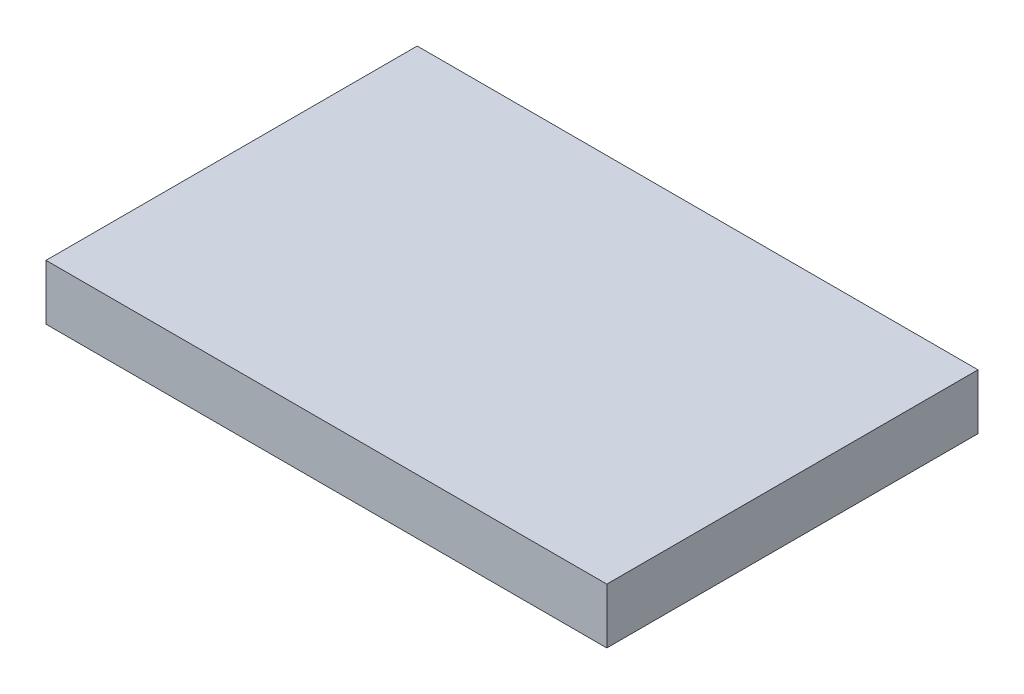
ISO-10303-21;
HEADER;
FILE_DESCRIPTION(('STEP AP214'),'2;1');
FILE_NAME('part.step','',(''),(''),'','','');
FILE_SCHEMA(('AUTOMOTIVE_DESIGN { 1 0 10303 214 1 1 1 1 }'));
ENDSEC;
DATA;
#1=APPLICATION_CONTEXT('core data for automotive mechanical design processes');
#2=APPLICATION_PROTOCOL_DEFINITION('international standard','automotive_design',2000,#1);
#3=PRODUCT_CONTEXT('',#1,'mechanical');
#4=PRODUCT('Part','Part','',(#3));
#5=PRODUCT_RELATED_PRODUCT_CATEGORY('part','',(#4));
#6=PRODUCT_DEFINITION_FORMATION('','',#4);
#7=PRODUCT_DEFINITION_CONTEXT('part definition',#1,'design');
#8=PRODUCT_DEFINITION('design','',#6,#7);
#9=PRODUCT_DEFINITION_SHAPE('','',#8);
#10=(LENGTH_UNIT() NAMED_UNIT(*) SI_UNIT(.MILLI.,.METRE.));
#11=(NAMED_UNIT(*) PLANE_ANGLE_UNIT() SI_UNIT($,.RADIAN.));
#12=(NAMED_UNIT(*) SI_UNIT($,.STERADIAN.) SOLID_ANGLE_UNIT());
#13=UNCERTAINTY_MEASURE_WITH_UNIT(LENGTH_MEASURE(1.E-05),#10,'distance_accuracy_value','');
#14=(GEOMETRIC_REPRESENTATION_CONTEXT(3) GLOBAL_UNCERTAINTY_ASSIGNED_CONTEXT((#13)) GLOBAL_UNIT_ASSIGNED_CONTEXT((#10,
#11,#12)) REPRESENTATION_CONTEXT('',''));
#15=CARTESIAN_POINT('',(0.,0.,0.));
#16=DIRECTION('',(0.,0.,1.));
#17=DIRECTION('',(1.,0.,0.));
#18=AXIS2_PLACEMENT_3D('',#15,#16,#17);
#19=CARTESIAN_POINT('',(0.,10.,0.));
#20=DIRECTION('',(1.,0.,0.));
#21=DIRECTION('',(0.,0.,-1.));
#22=AXIS2_PLACEMENT_3D('',#19,#20,#21);
#23=PLANE('',#22);
#24=DIRECTION('',(0.,0.,1.));
#25=VECTOR('',#24,1.);
#26=CARTESIAN_POINT('',(0.,0.,0.));
#27=LINE('',#26,#25);
#28=CARTESIAN_POINT('',(0.,0.,0.));
#29=VERTEX_POINT('',#28);
#30=CARTESIAN_POINT('',(0.,0.,67.0916750593987));
#31=VERTEX_POINT('',#30);
#32=EDGE_CURVE('E102',#29,#31,#27,.T.);
#33=ORIENTED_EDGE('',*,*,#32,.T.);
#34=DIRECTION('',(0.,-1.,0.));
#35=VECTOR('',#34,1.);
#36=CARTESIAN_POINT('',(0.,10.,67.0916750593987));
#37=LINE('',#36,#35);
#38=CARTESIAN_POINT('',(0.,10.,67.0916750593987));
#39=VERTEX_POINT('',#38);
#40=EDGE_CURVE('E11',#39,#31,#37,.T.);
#41=ORIENTED_EDGE('',*,*,#40,.F.);
#42=DIRECTION('',(0.,0.,1.));
#43=VECTOR('',#42,1.);
#44=CARTESIAN_POINT('',(0.,10.,0.));
#45=LINE('',#44,#43);
#46=CARTESIAN_POINT('',(0.,10.,0.));
#47=VERTEX_POINT('',#46);
#48=EDGE_CURVE('E90',#47,#39,#45,.T.);
#49=ORIENTED_EDGE('',*,*,#48,.F.);
#50=DIRECTION('',(0.,-1.,0.));
#51=VECTOR('',#50,1.);
#52=CARTESIAN_POINT('',(0.,10.,0.));
#53=LINE('',#52,#51);
#54=EDGE_CURVE('E98',#47,#29,#53,.T.);
#55=ORIENTED_EDGE('',*,*,#54,.T.);
#56=EDGE_LOOP('',(#33,#41,#49,#55));
#57=FACE_BOUND('',#56,.T.);
#58=ADVANCED_FACE('F39',(#57),#23,.F.);
#59=CARTESIAN_POINT('',(0.,10.,67.0916750593987));
#60=DIRECTION('',(0.,0.,-1.));
#61=DIRECTION('',(-1.,0.,0.));
#62=AXIS2_PLACEMENT_3D('',#59,#60,#61);
#63=PLANE('',#62);
#64=DIRECTION('',(1.,0.,0.));
#65=VECTOR('',#64,1.);
#66=CARTESIAN_POINT('',(0.,0.,67.0916750593987));
#67=LINE('',#66,#65);
#68=CARTESIAN_POINT('',(101.360299962995,0.,67.0916750593987));
#69=VERTEX_POINT('',#68);
#70=EDGE_CURVE('E94',#31,#69,#67,.T.);
#71=ORIENTED_EDGE('',*,*,#70,.T.);
#72=DIRECTION('',(0.,-1.,0.));
#73=VECTOR('',#72,1.);
#74=CARTESIAN_POINT('',(101.360299962995,10.,67.0916750593987));
#75=LINE('',#74,#73);
#76=CARTESIAN_POINT('',(101.360299962995,10.,67.0916750593987));
#77=VERTEX_POINT('',#76);
#78=EDGE_CURVE('E47',#77,#69,#75,.T.);
#79=ORIENTED_EDGE('',*,*,#78,.F.);
#80=DIRECTION('',(1.,0.,0.));
#81=VECTOR('',#80,1.);
#82=CARTESIAN_POINT('',(0.,10.,67.0916750593987));
#83=LINE('',#82,#81);
#84=EDGE_CURVE('E85',#39,#77,#83,.T.);
#85=ORIENTED_EDGE('',*,*,#84,.F.);
#86=ORIENTED_EDGE('',*,*,#40,.T.);
#87=EDGE_LOOP('',(#71,#79,#85,#86));
#88=FACE_BOUND('',#87,.T.);
#89=ADVANCED_FACE('F93',(#88),#63,.F.);
#90=CARTESIAN_POINT('',(101.360299962995,10.,0.));
#91=DIRECTION('',(-1.,0.,0.));
#92=DIRECTION('',(0.,0.,1.));
#93=AXIS2_PLACEMENT_3D('',#90,#91,#92);
#94=PLANE('',#93);
#95=DIRECTION('',(0.,0.,-1.));
#96=VECTOR('',#95,1.);
#97=CARTESIAN_POINT('',(101.360299962995,0.,0.));
#98=LINE('',#97,#96);
#99=CARTESIAN_POINT('',(101.360299962995,0.,0.));
#100=VERTEX_POINT('',#99);
#101=EDGE_CURVE('E72',#69,#100,#98,.T.);
#102=ORIENTED_EDGE('',*,*,#101,.T.);
#103=DIRECTION('',(0.,-1.,0.));
#104=VECTOR('',#103,1.);
#105=CARTESIAN_POINT('',(101.360299962995,10.,0.));
#106=LINE('',#105,#104);
#107=CARTESIAN_POINT('',(101.360299962995,10.,0.));
#108=VERTEX_POINT('',#107);
#109=EDGE_CURVE('E95',#108,#100,#106,.T.);
#110=ORIENTED_EDGE('',*,*,#109,.F.);
#111=DIRECTION('',(0.,0.,-1.));
#112=VECTOR('',#111,1.);
#113=CARTESIAN_POINT('',(101.360299962995,10.,0.));
#114=LINE('',#113,#112);
#115=EDGE_CURVE('E88',#77,#108,#114,.T.);
#116=ORIENTED_EDGE('',*,*,#115,.F.);
#117=ORIENTED_EDGE('',*,*,#78,.T.);
#118=EDGE_LOOP('',(#102,#110,#116,#117));
#119=FACE_BOUND('',#118,.T.);
#120=ADVANCED_FACE('F96',(#119),#94,.F.);
#121=CARTESIAN_POINT('',(0.,10.,0.));
#122=DIRECTION('',(0.,0.,1.));
#123=DIRECTION('',(1.,0.,0.));
#124=AXIS2_PLACEMENT_3D('',#121,#122,#123);
#125=PLANE('',#124);
#126=DIRECTION('',(-1.,0.,0.));
#127=VECTOR('',#126,1.);
#128=CARTESIAN_POINT('',(0.,0.,0.));
#129=LINE('',#128,#127);
#130=EDGE_CURVE('E78',#100,#29,#129,.T.);
#131=ORIENTED_EDGE('',*,*,#130,.T.);
#132=ORIENTED_EDGE('',*,*,#54,.F.);
#133=DIRECTION('',(-1.,0.,0.));
#134=VECTOR('',#133,1.);
#135=CARTESIAN_POINT('',(0.,10.,0.));
#136=LINE('',#135,#134);
#137=EDGE_CURVE('E55',#108,#47,#136,.T.);
#138=ORIENTED_EDGE('',*,*,#137,.F.);
#139=ORIENTED_EDGE('',*,*,#109,.T.);
#140=EDGE_LOOP('',(#131,#132,#138,#139));
#141=FACE_BOUND('',#140,.T.);
#142=ADVANCED_FACE('F109',(#141),#125,.F.);
#143=CARTESIAN_POINT('',(0.,10.,0.));
#144=DIRECTION('',(0.,1.,0.));
#145=DIRECTION('',(0.,0.,1.));
#146=AXIS2_PLACEMENT_3D('',#143,#144,#145);
#147=PLANE('',#146);
#148=ORIENTED_EDGE('',*,*,#48,.T.);
#149=ORIENTED_EDGE('',*,*,#84,.T.);
#150=ORIENTED_EDGE('',*,*,#115,.T.);
#151=ORIENTED_EDGE('',*,*,#137,.T.);
#152=EDGE_LOOP('',(#148,#149,#150,#151));
#153=FACE_BOUND('',#152,.T.);
#154=ADVANCED_FACE('F86',(#153),#147,.T.);
#155=CARTESIAN_POINT('',(0.,0.,0.));
#156=DIRECTION('',(0.,1.,0.));
#157=DIRECTION('',(0.,0.,1.));
#158=AXIS2_PLACEMENT_3D('',#155,#156,#157);
#159=PLANE('',#158);
#160=ORIENTED_EDGE('',*,*,#32,.F.);
#161=ORIENTED_EDGE('',*,*,#130,.F.);
#162=ORIENTED_EDGE('',*,*,#101,.F.);
#163=ORIENTED_EDGE('',*,*,#70,.F.);
#164=EDGE_LOOP('',(#160,#161,#162,#163));
#165=FACE_BOUND('',#164,.T.);
#166=ADVANCED_FACE('F112',(#165),#159,.F.);
#167=CLOSED_SHELL('',(#58,#89,#120,#142,#154,#166));
#168=MANIFOLD_SOLID_BREP('B2',#167);
#169=ADVANCED_BREP_SHAPE_REPRESENTATION('',(#18,#168),#14);
#170=SHAPE_DEFINITION_REPRESENTATION(#9,#169);
ENDSEC;
END-ISO-10303-21;
